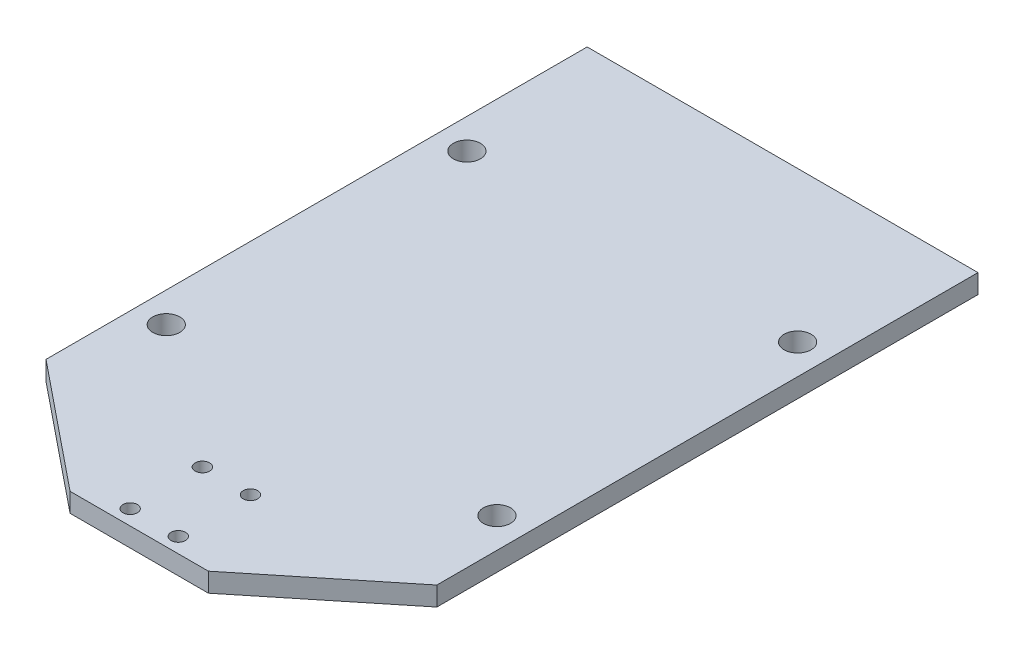
ISO-10303-21;
HEADER;
FILE_DESCRIPTION(('STEP AP214'),'2;1');
FILE_NAME('part.step','',(''),(''),'','','');
FILE_SCHEMA(('AUTOMOTIVE_DESIGN { 1 0 10303 214 1 1 1 1 }'));
ENDSEC;
DATA;
#1=APPLICATION_CONTEXT('core data for automotive mechanical design processes');
#2=APPLICATION_PROTOCOL_DEFINITION('international standard','automotive_design',2000,#1);
#3=PRODUCT_CONTEXT('',#1,'mechanical');
#4=PRODUCT('Part','Part','',(#3));
#5=PRODUCT_RELATED_PRODUCT_CATEGORY('part','',(#4));
#6=PRODUCT_DEFINITION_FORMATION('','',#4);
#7=PRODUCT_DEFINITION_CONTEXT('part definition',#1,'design');
#8=PRODUCT_DEFINITION('design','',#6,#7);
#9=PRODUCT_DEFINITION_SHAPE('','',#8);
#10=(LENGTH_UNIT() NAMED_UNIT(*) SI_UNIT(.MILLI.,.METRE.));
#11=(NAMED_UNIT(*) PLANE_ANGLE_UNIT() SI_UNIT($,.RADIAN.));
#12=(NAMED_UNIT(*) SI_UNIT($,.STERADIAN.) SOLID_ANGLE_UNIT());
#13=UNCERTAINTY_MEASURE_WITH_UNIT(LENGTH_MEASURE(1.E-05),#10,'distance_accuracy_value','');
#14=(GEOMETRIC_REPRESENTATION_CONTEXT(3) GLOBAL_UNCERTAINTY_ASSIGNED_CONTEXT((#13)) GLOBAL_UNIT_ASSIGNED_CONTEXT((#10,
#11,#12)) REPRESENTATION_CONTEXT('',''));
#15=CARTESIAN_POINT('',(0.,0.,0.));
#16=DIRECTION('',(0.,0.,1.));
#17=DIRECTION('',(1.,0.,0.));
#18=AXIS2_PLACEMENT_3D('',#15,#16,#17);
#19=CARTESIAN_POINT('',(0.,1.5875,62.));
#20=DIRECTION('',(0.,0.,-1.));
#21=DIRECTION('',(-1.,0.,0.));
#22=AXIS2_PLACEMENT_3D('',#19,#20,#21);
#23=PLANE('',#22);
#24=DIRECTION('',(1.,0.,0.));
#25=VECTOR('',#24,1.);
#26=CARTESIAN_POINT('',(0.,-1.5875,62.));
#27=LINE('',#26,#25);
#28=CARTESIAN_POINT('',(-11.5,-1.5875,62.));
#29=VERTEX_POINT('',#28);
#30=CARTESIAN_POINT('',(11.5,-1.5875,62.));
#31=VERTEX_POINT('',#30);
#32=EDGE_CURVE('E137',#29,#31,#27,.T.);
#33=ORIENTED_EDGE('',*,*,#32,.T.);
#34=DIRECTION('',(0.,-1.,0.));
#35=VECTOR('',#34,1.);
#36=CARTESIAN_POINT('',(11.5,1.5875,62.));
#37=LINE('',#36,#35);
#38=CARTESIAN_POINT('',(11.5,1.5875,62.));
#39=VERTEX_POINT('',#38);
#40=EDGE_CURVE('E11',#39,#31,#37,.T.);
#41=ORIENTED_EDGE('',*,*,#40,.F.);
#42=DIRECTION('',(1.,0.,0.));
#43=VECTOR('',#42,1.);
#44=CARTESIAN_POINT('',(0.,1.5875,62.));
#45=LINE('',#44,#43);
#46=CARTESIAN_POINT('',(-11.5,1.5875,62.));
#47=VERTEX_POINT('',#46);
#48=EDGE_CURVE('E156',#47,#39,#45,.T.);
#49=ORIENTED_EDGE('',*,*,#48,.F.);
#50=DIRECTION('',(0.,-1.,0.));
#51=VECTOR('',#50,1.);
#52=CARTESIAN_POINT('',(-11.5,1.5875,62.));
#53=LINE('',#52,#51);
#54=EDGE_CURVE('E64',#47,#29,#53,.T.);
#55=ORIENTED_EDGE('',*,*,#54,.T.);
#56=EDGE_LOOP('',(#33,#41,#49,#55));
#57=FACE_BOUND('',#56,.T.);
#58=ADVANCED_FACE('F47',(#57),#23,.F.);
#59=CARTESIAN_POINT('',(34.8732876712329,1.5875,43.0787671232877));
#60=DIRECTION('',(-0.629198228667964,0.,-0.777244870707486));
#61=DIRECTION('',(-0.777244870707486,0.,0.629198228667964));
#62=AXIS2_PLACEMENT_3D('',#59,#60,#61);
#63=PLANE('',#62);
#64=DIRECTION('',(0.777244870707486,0.,-0.629198228667964));
#65=VECTOR('',#64,1.);
#66=CARTESIAN_POINT('',(34.8732876712329,-1.5875,43.0787671232877));
#67=LINE('',#66,#65);
#68=CARTESIAN_POINT('',(32.5,-1.5875,45.));
#69=VERTEX_POINT('',#68);
#70=EDGE_CURVE('E140',#31,#69,#67,.T.);
#71=ORIENTED_EDGE('',*,*,#70,.T.);
#72=DIRECTION('',(0.,-1.,0.));
#73=VECTOR('',#72,1.);
#74=CARTESIAN_POINT('',(32.5,1.5875,45.));
#75=LINE('',#74,#73);
#76=CARTESIAN_POINT('',(32.5,1.5875,45.));
#77=VERTEX_POINT('',#76);
#78=EDGE_CURVE('E56',#77,#69,#75,.T.);
#79=ORIENTED_EDGE('',*,*,#78,.F.);
#80=DIRECTION('',(0.777244870707486,0.,-0.629198228667964));
#81=VECTOR('',#80,1.);
#82=CARTESIAN_POINT('',(34.8732876712329,1.5875,43.0787671232877));
#83=LINE('',#82,#81);
#84=EDGE_CURVE('E96',#39,#77,#83,.T.);
#85=ORIENTED_EDGE('',*,*,#84,.F.);
#86=ORIENTED_EDGE('',*,*,#40,.T.);
#87=EDGE_LOOP('',(#71,#79,#85,#86));
#88=FACE_BOUND('',#87,.T.);
#89=ADVANCED_FACE('F182',(#88),#63,.F.);
#90=CARTESIAN_POINT('',(32.5,1.5875,0.));
#91=DIRECTION('',(-1.,0.,0.));
#92=DIRECTION('',(0.,0.,1.));
#93=AXIS2_PLACEMENT_3D('',#90,#91,#92);
#94=PLANE('',#93);
#95=DIRECTION('',(0.,0.,-1.));
#96=VECTOR('',#95,1.);
#97=CARTESIAN_POINT('',(32.5,-1.5875,0.));
#98=LINE('',#97,#96);
#99=CARTESIAN_POINT('',(32.5,-1.5875,-45.));
#100=VERTEX_POINT('',#99);
#101=EDGE_CURVE('E144',#69,#100,#98,.T.);
#102=ORIENTED_EDGE('',*,*,#101,.T.);
#103=DIRECTION('',(0.,-1.,0.));
#104=VECTOR('',#103,1.);
#105=CARTESIAN_POINT('',(32.5,1.5875,-45.));
#106=LINE('',#105,#104);
#107=CARTESIAN_POINT('',(32.5,1.5875,-45.));
#108=VERTEX_POINT('',#107);
#109=EDGE_CURVE('E127',#108,#100,#106,.T.);
#110=ORIENTED_EDGE('',*,*,#109,.F.);
#111=DIRECTION('',(0.,0.,-1.));
#112=VECTOR('',#111,1.);
#113=CARTESIAN_POINT('',(32.5,1.5875,0.));
#114=LINE('',#113,#112);
#115=EDGE_CURVE('E113',#77,#108,#114,.T.);
#116=ORIENTED_EDGE('',*,*,#115,.F.);
#117=ORIENTED_EDGE('',*,*,#78,.T.);
#118=EDGE_LOOP('',(#102,#110,#116,#117));
#119=FACE_BOUND('',#118,.T.);
#120=ADVANCED_FACE('F166',(#119),#94,.F.);
#121=CARTESIAN_POINT('',(0.,1.5875,-45.));
#122=DIRECTION('',(0.,0.,1.));
#123=DIRECTION('',(1.,0.,0.));
#124=AXIS2_PLACEMENT_3D('',#121,#122,#123);
#125=PLANE('',#124);
#126=DIRECTION('',(-1.,0.,0.));
#127=VECTOR('',#126,1.);
#128=CARTESIAN_POINT('',(0.,-1.5875,-45.));
#129=LINE('',#128,#127);
#130=CARTESIAN_POINT('',(-32.5,-1.5875,-45.));
#131=VERTEX_POINT('',#130);
#132=EDGE_CURVE('E123',#100,#131,#129,.T.);
#133=ORIENTED_EDGE('',*,*,#132,.T.);
#134=DIRECTION('',(0.,-1.,0.));
#135=VECTOR('',#134,1.);
#136=CARTESIAN_POINT('',(-32.5,1.5875,-45.));
#137=LINE('',#136,#135);
#138=CARTESIAN_POINT('',(-32.5,1.5875,-45.));
#139=VERTEX_POINT('',#138);
#140=EDGE_CURVE('E120',#139,#131,#137,.T.);
#141=ORIENTED_EDGE('',*,*,#140,.F.);
#142=DIRECTION('',(-1.,0.,0.));
#143=VECTOR('',#142,1.);
#144=CARTESIAN_POINT('',(0.,1.5875,-45.));
#145=LINE('',#144,#143);
#146=EDGE_CURVE('E106',#108,#139,#145,.T.);
#147=ORIENTED_EDGE('',*,*,#146,.F.);
#148=ORIENTED_EDGE('',*,*,#109,.T.);
#149=EDGE_LOOP('',(#133,#141,#147,#148));
#150=FACE_BOUND('',#149,.T.);
#151=ADVANCED_FACE('F121',(#150),#125,.F.);
#152=CARTESIAN_POINT('',(-32.5,1.5875,0.));
#153=DIRECTION('',(-1.,0.,0.));
#154=DIRECTION('',(0.,0.,1.));
#155=AXIS2_PLACEMENT_3D('',#152,#153,#154);
#156=PLANE('',#155);
#157=DIRECTION('',(0.,0.,-1.));
#158=VECTOR('',#157,1.);
#159=CARTESIAN_POINT('',(-32.5,-1.5875,0.));
#160=LINE('',#159,#158);
#161=CARTESIAN_POINT('',(-32.5,-1.5875,45.));
#162=VERTEX_POINT('',#161);
#163=EDGE_CURVE('E149',#162,#131,#160,.T.);
#164=ORIENTED_EDGE('',*,*,#163,.F.);
#165=DIRECTION('',(0.,-1.,0.));
#166=VECTOR('',#165,1.);
#167=CARTESIAN_POINT('',(-32.5,1.5875,45.));
#168=LINE('',#167,#166);
#169=CARTESIAN_POINT('',(-32.5,1.5875,45.));
#170=VERTEX_POINT('',#169);
#171=EDGE_CURVE('E84',#170,#162,#168,.T.);
#172=ORIENTED_EDGE('',*,*,#171,.F.);
#173=DIRECTION('',(0.,0.,-1.));
#174=VECTOR('',#173,1.);
#175=CARTESIAN_POINT('',(-32.5,1.5875,0.));
#176=LINE('',#175,#174);
#177=EDGE_CURVE('E111',#170,#139,#176,.T.);
#178=ORIENTED_EDGE('',*,*,#177,.T.);
#179=ORIENTED_EDGE('',*,*,#140,.T.);
#180=EDGE_LOOP('',(#164,#172,#178,#179));
#181=FACE_BOUND('',#180,.T.);
#182=ADVANCED_FACE('F129',(#181),#156,.T.);
#183=CARTESIAN_POINT('',(-34.8732876712329,1.5875,43.0787671232876));
#184=DIRECTION('',(-0.629198228667965,0.,0.777244870707485));
#185=DIRECTION('',(0.777244870707485,0.,0.629198228667965));
#186=AXIS2_PLACEMENT_3D('',#183,#184,#185);
#187=PLANE('',#186);
#188=DIRECTION('',(-0.777244870707485,0.,-0.629198228667965));
#189=VECTOR('',#188,1.);
#190=CARTESIAN_POINT('',(-34.8732876712329,-1.5875,43.0787671232876));
#191=LINE('',#190,#189);
#192=EDGE_CURVE('E152',#29,#162,#191,.T.);
#193=ORIENTED_EDGE('',*,*,#192,.F.);
#194=ORIENTED_EDGE('',*,*,#54,.F.);
#195=DIRECTION('',(-0.777244870707485,0.,-0.629198228667965));
#196=VECTOR('',#195,1.);
#197=CARTESIAN_POINT('',(-34.8732876712329,1.5875,43.0787671232876));
#198=LINE('',#197,#196);
#199=EDGE_CURVE('E131',#47,#170,#198,.T.);
#200=ORIENTED_EDGE('',*,*,#199,.T.);
#201=ORIENTED_EDGE('',*,*,#171,.T.);
#202=EDGE_LOOP('',(#193,#194,#200,#201));
#203=FACE_BOUND('',#202,.T.);
#204=ADVANCED_FACE('F169',(#203),#187,.T.);
#205=CARTESIAN_POINT('',(0.,1.5875,0.));
#206=DIRECTION('',(0.,1.,0.));
#207=DIRECTION('',(0.,0.,1.));
#208=AXIS2_PLACEMENT_3D('',#205,#206,#207);
#209=PLANE('',#208);
#210=CARTESIAN_POINT('',(-27.5,1.5875,-20.));
#211=DIRECTION('',(0.,1.,0.));
#212=DIRECTION('',(0.,0.,1.));
#213=AXIS2_PLACEMENT_3D('',#210,#211,#212);
#214=CIRCLE('',#213,2.24999999999999);
#215=CARTESIAN_POINT('',(-27.5,1.5875,-17.75));
#216=VERTEX_POINT('',#215);
#217=EDGE_CURVE('E252',#216,#216,#214,.T.);
#218=ORIENTED_EDGE('',*,*,#217,.F.);
#219=EDGE_LOOP('',(#218));
#220=FACE_BOUND('',#219,.T.);
#221=CARTESIAN_POINT('',(27.5,1.5875,-20.));
#222=DIRECTION('',(0.,1.,0.));
#223=DIRECTION('',(0.,0.,1.));
#224=AXIS2_PLACEMENT_3D('',#221,#222,#223);
#225=CIRCLE('',#224,2.24999999999999);
#226=CARTESIAN_POINT('',(27.5,1.5875,-17.75));
#227=VERTEX_POINT('',#226);
#228=EDGE_CURVE('E244',#227,#227,#225,.T.);
#229=ORIENTED_EDGE('',*,*,#228,.F.);
#230=EDGE_LOOP('',(#229));
#231=FACE_BOUND('',#230,.T.);
#232=CARTESIAN_POINT('',(27.5,1.5875,30.));
#233=DIRECTION('',(0.,1.,0.));
#234=DIRECTION('',(0.,0.,1.));
#235=AXIS2_PLACEMENT_3D('',#232,#233,#234);
#236=CIRCLE('',#235,2.24999999999999);
#237=CARTESIAN_POINT('',(27.5,1.5875,32.25));
#238=VERTEX_POINT('',#237);
#239=EDGE_CURVE('E236',#238,#238,#236,.T.);
#240=ORIENTED_EDGE('',*,*,#239,.F.);
#241=EDGE_LOOP('',(#240));
#242=FACE_BOUND('',#241,.T.);
#243=CARTESIAN_POINT('',(-27.5,1.5875,30.));
#244=DIRECTION('',(0.,1.,0.));
#245=DIRECTION('',(0.,0.,1.));
#246=AXIS2_PLACEMENT_3D('',#243,#244,#245);
#247=CIRCLE('',#246,2.24999999999999);
#248=CARTESIAN_POINT('',(-27.5,1.5875,32.25));
#249=VERTEX_POINT('',#248);
#250=EDGE_CURVE('E228',#249,#249,#247,.T.);
#251=ORIENTED_EDGE('',*,*,#250,.F.);
#252=EDGE_LOOP('',(#251));
#253=FACE_BOUND('',#252,.T.);
#254=CARTESIAN_POINT('',(-4.,1.5875,59.5));
#255=DIRECTION('',(0.,1.,0.));
#256=DIRECTION('',(0.,0.,1.));
#257=AXIS2_PLACEMENT_3D('',#254,#255,#256);
#258=CIRCLE('',#257,1.2);
#259=CARTESIAN_POINT('',(-4.,1.5875,60.7));
#260=VERTEX_POINT('',#259);
#261=EDGE_CURVE('E220',#260,#260,#258,.T.);
#262=ORIENTED_EDGE('',*,*,#261,.F.);
#263=EDGE_LOOP('',(#262));
#264=FACE_BOUND('',#263,.T.);
#265=CARTESIAN_POINT('',(4.,1.5875,59.5));
#266=DIRECTION('',(0.,1.,0.));
#267=DIRECTION('',(0.,0.,1.));
#268=AXIS2_PLACEMENT_3D('',#265,#266,#267);
#269=CIRCLE('',#268,1.2);
#270=CARTESIAN_POINT('',(4.,1.5875,60.7));
#271=VERTEX_POINT('',#270);
#272=EDGE_CURVE('E212',#271,#271,#269,.T.);
#273=ORIENTED_EDGE('',*,*,#272,.F.);
#274=EDGE_LOOP('',(#273));
#275=FACE_BOUND('',#274,.T.);
#276=CARTESIAN_POINT('',(4.,1.5875,47.5));
#277=DIRECTION('',(0.,1.,0.));
#278=DIRECTION('',(0.,0.,1.));
#279=AXIS2_PLACEMENT_3D('',#276,#277,#278);
#280=CIRCLE('',#279,1.2);
#281=CARTESIAN_POINT('',(4.,1.5875,48.7));
#282=VERTEX_POINT('',#281);
#283=EDGE_CURVE('E204',#282,#282,#280,.T.);
#284=ORIENTED_EDGE('',*,*,#283,.F.);
#285=EDGE_LOOP('',(#284));
#286=FACE_BOUND('',#285,.T.);
#287=CARTESIAN_POINT('',(-4.,1.5875,47.5));
#288=DIRECTION('',(0.,1.,0.));
#289=DIRECTION('',(0.,0.,1.));
#290=AXIS2_PLACEMENT_3D('',#287,#288,#289);
#291=CIRCLE('',#290,1.2);
#292=CARTESIAN_POINT('',(-4.,1.5875,48.7));
#293=VERTEX_POINT('',#292);
#294=EDGE_CURVE('E196',#293,#293,#291,.T.);
#295=ORIENTED_EDGE('',*,*,#294,.F.);
#296=EDGE_LOOP('',(#295));
#297=FACE_BOUND('',#296,.T.);
#298=ORIENTED_EDGE('',*,*,#48,.T.);
#299=ORIENTED_EDGE('',*,*,#84,.T.);
#300=ORIENTED_EDGE('',*,*,#115,.T.);
#301=ORIENTED_EDGE('',*,*,#146,.T.);
#302=ORIENTED_EDGE('',*,*,#177,.F.);
#303=ORIENTED_EDGE('',*,*,#199,.F.);
#304=EDGE_LOOP('',(#298,#299,#300,#301,#302,#303));
#305=FACE_BOUND('',#304,.T.);
#306=ADVANCED_FACE('F108',(#220,#231,#242,#253,#264,#275,#286,#297,#305),#209,.T.);
#307=CARTESIAN_POINT('',(0.,-1.5875,0.));
#308=DIRECTION('',(0.,1.,0.));
#309=DIRECTION('',(0.,0.,1.));
#310=AXIS2_PLACEMENT_3D('',#307,#308,#309);
#311=PLANE('',#310);
#312=CARTESIAN_POINT('',(-27.5,-1.5875,-20.));
#313=DIRECTION('',(0.,1.,0.));
#314=DIRECTION('',(0.,0.,1.));
#315=AXIS2_PLACEMENT_3D('',#312,#313,#314);
#316=CIRCLE('',#315,2.25);
#317=CARTESIAN_POINT('',(-27.5,-1.5875,-17.75));
#318=VERTEX_POINT('',#317);
#319=EDGE_CURVE('E248',#318,#318,#316,.T.);
#320=ORIENTED_EDGE('',*,*,#319,.T.);
#321=EDGE_LOOP('',(#320));
#322=FACE_BOUND('',#321,.T.);
#323=CARTESIAN_POINT('',(27.5,-1.5875,-20.));
#324=DIRECTION('',(0.,1.,0.));
#325=DIRECTION('',(0.,0.,1.));
#326=AXIS2_PLACEMENT_3D('',#323,#324,#325);
#327=CIRCLE('',#326,2.25);
#328=CARTESIAN_POINT('',(27.5,-1.5875,-17.75));
#329=VERTEX_POINT('',#328);
#330=EDGE_CURVE('E240',#329,#329,#327,.T.);
#331=ORIENTED_EDGE('',*,*,#330,.T.);
#332=EDGE_LOOP('',(#331));
#333=FACE_BOUND('',#332,.T.);
#334=CARTESIAN_POINT('',(27.5,-1.5875,30.));
#335=DIRECTION('',(0.,1.,0.));
#336=DIRECTION('',(0.,0.,1.));
#337=AXIS2_PLACEMENT_3D('',#334,#335,#336);
#338=CIRCLE('',#337,2.25);
#339=CARTESIAN_POINT('',(27.5,-1.5875,32.25));
#340=VERTEX_POINT('',#339);
#341=EDGE_CURVE('E232',#340,#340,#338,.T.);
#342=ORIENTED_EDGE('',*,*,#341,.T.);
#343=EDGE_LOOP('',(#342));
#344=FACE_BOUND('',#343,.T.);
#345=CARTESIAN_POINT('',(-27.5,-1.5875,30.));
#346=DIRECTION('',(0.,1.,0.));
#347=DIRECTION('',(0.,0.,1.));
#348=AXIS2_PLACEMENT_3D('',#345,#346,#347);
#349=CIRCLE('',#348,2.25);
#350=CARTESIAN_POINT('',(-27.5,-1.5875,32.25));
#351=VERTEX_POINT('',#350);
#352=EDGE_CURVE('E224',#351,#351,#349,.T.);
#353=ORIENTED_EDGE('',*,*,#352,.T.);
#354=EDGE_LOOP('',(#353));
#355=FACE_BOUND('',#354,.T.);
#356=CARTESIAN_POINT('',(-4.,-1.5875,59.5));
#357=DIRECTION('',(0.,1.,0.));
#358=DIRECTION('',(0.,0.,1.));
#359=AXIS2_PLACEMENT_3D('',#356,#357,#358);
#360=CIRCLE('',#359,1.19999999999999);
#361=CARTESIAN_POINT('',(-4.,-1.5875,60.7));
#362=VERTEX_POINT('',#361);
#363=EDGE_CURVE('E216',#362,#362,#360,.T.);
#364=ORIENTED_EDGE('',*,*,#363,.T.);
#365=EDGE_LOOP('',(#364));
#366=FACE_BOUND('',#365,.T.);
#367=CARTESIAN_POINT('',(4.,-1.5875,59.5));
#368=DIRECTION('',(0.,1.,0.));
#369=DIRECTION('',(0.,0.,1.));
#370=AXIS2_PLACEMENT_3D('',#367,#368,#369);
#371=CIRCLE('',#370,1.19999999999999);
#372=CARTESIAN_POINT('',(4.,-1.5875,60.7));
#373=VERTEX_POINT('',#372);
#374=EDGE_CURVE('E208',#373,#373,#371,.T.);
#375=ORIENTED_EDGE('',*,*,#374,.T.);
#376=EDGE_LOOP('',(#375));
#377=FACE_BOUND('',#376,.T.);
#378=CARTESIAN_POINT('',(4.,-1.5875,47.5));
#379=DIRECTION('',(0.,1.,0.));
#380=DIRECTION('',(0.,0.,1.));
#381=AXIS2_PLACEMENT_3D('',#378,#379,#380);
#382=CIRCLE('',#381,1.19999999999999);
#383=CARTESIAN_POINT('',(4.,-1.5875,48.7));
#384=VERTEX_POINT('',#383);
#385=EDGE_CURVE('E200',#384,#384,#382,.T.);
#386=ORIENTED_EDGE('',*,*,#385,.T.);
#387=EDGE_LOOP('',(#386));
#388=FACE_BOUND('',#387,.T.);
#389=CARTESIAN_POINT('',(-4.,-1.5875,47.5));
#390=DIRECTION('',(0.,1.,0.));
#391=DIRECTION('',(0.,0.,1.));
#392=AXIS2_PLACEMENT_3D('',#389,#390,#391);
#393=CIRCLE('',#392,1.19999999999999);
#394=CARTESIAN_POINT('',(-4.,-1.5875,48.7));
#395=VERTEX_POINT('',#394);
#396=EDGE_CURVE('E141',#395,#395,#393,.T.);
#397=ORIENTED_EDGE('',*,*,#396,.T.);
#398=EDGE_LOOP('',(#397));
#399=FACE_BOUND('',#398,.T.);
#400=ORIENTED_EDGE('',*,*,#32,.F.);
#401=ORIENTED_EDGE('',*,*,#192,.T.);
#402=ORIENTED_EDGE('',*,*,#163,.T.);
#403=ORIENTED_EDGE('',*,*,#132,.F.);
#404=ORIENTED_EDGE('',*,*,#101,.F.);
#405=ORIENTED_EDGE('',*,*,#70,.F.);
#406=EDGE_LOOP('',(#400,#401,#402,#403,#404,#405));
#407=FACE_BOUND('',#406,.T.);
#408=ADVANCED_FACE('F168',(#322,#333,#344,#355,#366,#377,#388,#399,#407),#311,.F.);
#409=CARTESIAN_POINT('',(-4.,1.5875,47.5));
#410=DIRECTION('',(0.,1.,0.));
#411=DIRECTION('',(0.,0.,1.));
#412=AXIS2_PLACEMENT_3D('',#409,#410,#411);
#413=CYLINDRICAL_SURFACE('',#412,1.19999999999999);
#414=ORIENTED_EDGE('',*,*,#396,.F.);
#415=EDGE_LOOP('',(#414));
#416=FACE_BOUND('',#415,.T.);
#417=ORIENTED_EDGE('',*,*,#294,.T.);
#418=EDGE_LOOP('',(#417));
#419=FACE_BOUND('',#418,.T.);
#420=ADVANCED_FACE('F273',(#416,#419),#413,.F.);
#421=CARTESIAN_POINT('',(4.,1.5875,47.5));
#422=DIRECTION('',(0.,1.,0.));
#423=DIRECTION('',(0.,0.,1.));
#424=AXIS2_PLACEMENT_3D('',#421,#422,#423);
#425=CYLINDRICAL_SURFACE('',#424,1.19999999999999);
#426=ORIENTED_EDGE('',*,*,#385,.F.);
#427=EDGE_LOOP('',(#426));
#428=FACE_BOUND('',#427,.T.);
#429=ORIENTED_EDGE('',*,*,#283,.T.);
#430=EDGE_LOOP('',(#429));
#431=FACE_BOUND('',#430,.T.);
#432=ADVANCED_FACE('F274',(#428,#431),#425,.F.);
#433=CARTESIAN_POINT('',(4.,1.5875,59.5));
#434=DIRECTION('',(0.,1.,0.));
#435=DIRECTION('',(0.,0.,1.));
#436=AXIS2_PLACEMENT_3D('',#433,#434,#435);
#437=CYLINDRICAL_SURFACE('',#436,1.19999999999999);
#438=ORIENTED_EDGE('',*,*,#374,.F.);
#439=EDGE_LOOP('',(#438));
#440=FACE_BOUND('',#439,.T.);
#441=ORIENTED_EDGE('',*,*,#272,.T.);
#442=EDGE_LOOP('',(#441));
#443=FACE_BOUND('',#442,.T.);
#444=ADVANCED_FACE('F280',(#440,#443),#437,.F.);
#445=CARTESIAN_POINT('',(-4.,1.5875,59.5));
#446=DIRECTION('',(0.,1.,0.));
#447=DIRECTION('',(0.,0.,1.));
#448=AXIS2_PLACEMENT_3D('',#445,#446,#447);
#449=CYLINDRICAL_SURFACE('',#448,1.19999999999999);
#450=ORIENTED_EDGE('',*,*,#363,.F.);
#451=EDGE_LOOP('',(#450));
#452=FACE_BOUND('',#451,.T.);
#453=ORIENTED_EDGE('',*,*,#261,.T.);
#454=EDGE_LOOP('',(#453));
#455=FACE_BOUND('',#454,.T.);
#456=ADVANCED_FACE('F289',(#452,#455),#449,.F.);
#457=CARTESIAN_POINT('',(-27.5,1.5875,30.));
#458=DIRECTION('',(0.,1.,0.));
#459=DIRECTION('',(0.,0.,1.));
#460=AXIS2_PLACEMENT_3D('',#457,#458,#459);
#461=CYLINDRICAL_SURFACE('',#460,2.24999999999999);
#462=ORIENTED_EDGE('',*,*,#352,.F.);
#463=EDGE_LOOP('',(#462));
#464=FACE_BOUND('',#463,.T.);
#465=ORIENTED_EDGE('',*,*,#250,.T.);
#466=EDGE_LOOP('',(#465));
#467=FACE_BOUND('',#466,.T.);
#468=ADVANCED_FACE('F293',(#464,#467),#461,.F.);
#469=CARTESIAN_POINT('',(27.5,1.5875,30.));
#470=DIRECTION('',(0.,1.,0.));
#471=DIRECTION('',(0.,0.,1.));
#472=AXIS2_PLACEMENT_3D('',#469,#470,#471);
#473=CYLINDRICAL_SURFACE('',#472,2.24999999999999);
#474=ORIENTED_EDGE('',*,*,#341,.F.);
#475=EDGE_LOOP('',(#474));
#476=FACE_BOUND('',#475,.T.);
#477=ORIENTED_EDGE('',*,*,#239,.T.);
#478=EDGE_LOOP('',(#477));
#479=FACE_BOUND('',#478,.T.);
#480=ADVANCED_FACE('F297',(#476,#479),#473,.F.);
#481=CARTESIAN_POINT('',(27.5,1.5875,-20.));
#482=DIRECTION('',(0.,1.,0.));
#483=DIRECTION('',(0.,0.,1.));
#484=AXIS2_PLACEMENT_3D('',#481,#482,#483);
#485=CYLINDRICAL_SURFACE('',#484,2.24999999999999);
#486=ORIENTED_EDGE('',*,*,#330,.F.);
#487=EDGE_LOOP('',(#486));
#488=FACE_BOUND('',#487,.T.);
#489=ORIENTED_EDGE('',*,*,#228,.T.);
#490=EDGE_LOOP('',(#489));
#491=FACE_BOUND('',#490,.T.);
#492=ADVANCED_FACE('F301',(#488,#491),#485,.F.);
#493=CARTESIAN_POINT('',(-27.5,1.5875,-20.));
#494=DIRECTION('',(0.,1.,0.));
#495=DIRECTION('',(0.,0.,1.));
#496=AXIS2_PLACEMENT_3D('',#493,#494,#495);
#497=CYLINDRICAL_SURFACE('',#496,2.24999999999999);
#498=ORIENTED_EDGE('',*,*,#319,.F.);
#499=EDGE_LOOP('',(#498));
#500=FACE_BOUND('',#499,.T.);
#501=ORIENTED_EDGE('',*,*,#217,.T.);
#502=EDGE_LOOP('',(#501));
#503=FACE_BOUND('',#502,.T.);
#504=ADVANCED_FACE('F257',(#500,#503),#497,.F.);
#505=CLOSED_SHELL('',(#58,#89,#120,#151,#182,#204,#306,#408,#420,#432,#444,#456,#468,#480,#492,#504));
#506=MANIFOLD_SOLID_BREP('B2',#505);
#507=ADVANCED_BREP_SHAPE_REPRESENTATION('',(#18,#506),#14);
#508=SHAPE_DEFINITION_REPRESENTATION(#9,#507);
ENDSEC;
END-ISO-10303-21;
